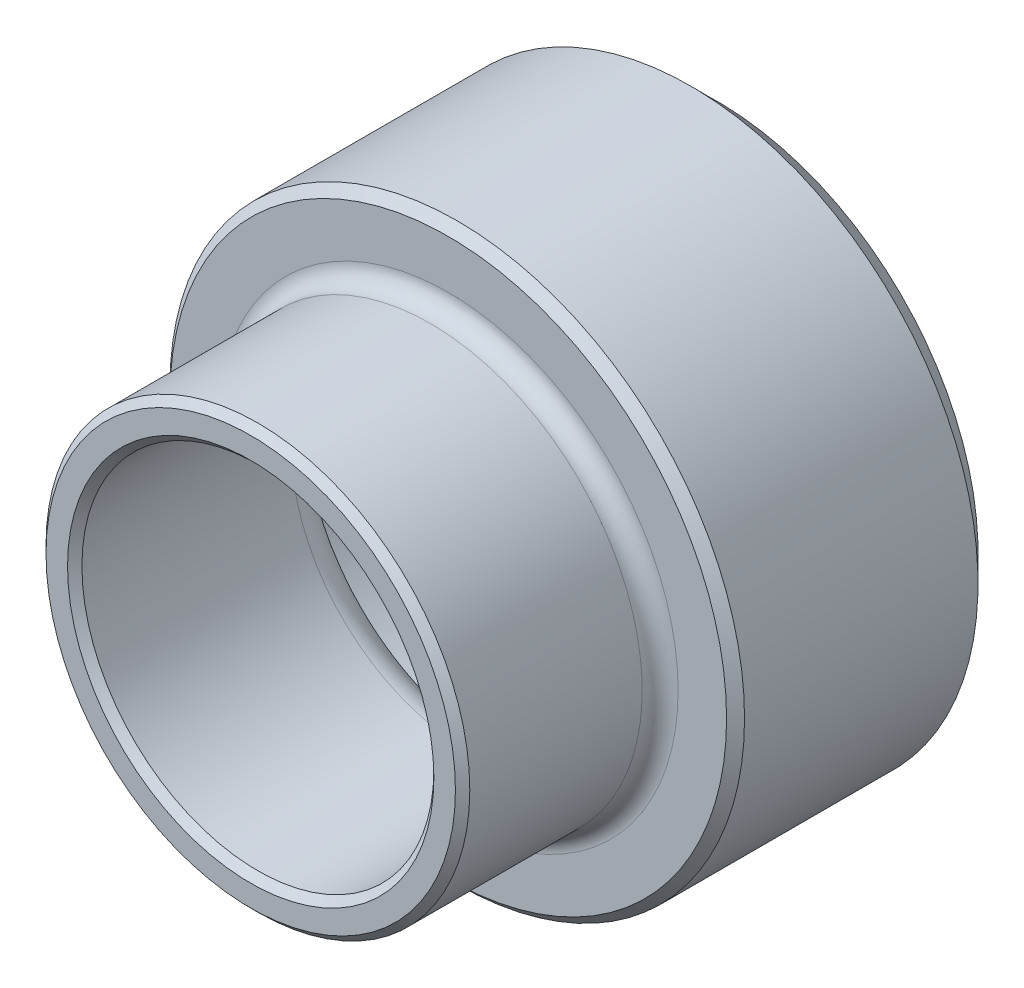
ISO-10303-21;
HEADER;
FILE_DESCRIPTION(('STEP AP214'),'2;1');
FILE_NAME('part.step','',(''),(''),'','','');
FILE_SCHEMA(('AUTOMOTIVE_DESIGN { 1 0 10303 214 1 1 1 1 }'));
ENDSEC;
DATA;
#1=APPLICATION_CONTEXT('core data for automotive mechanical design processes');
#2=APPLICATION_PROTOCOL_DEFINITION('international standard','automotive_design',2000,#1);
#3=PRODUCT_CONTEXT('',#1,'mechanical');
#4=PRODUCT('Part','Part','',(#3));
#5=PRODUCT_RELATED_PRODUCT_CATEGORY('part','',(#4));
#6=PRODUCT_DEFINITION_FORMATION('','',#4);
#7=PRODUCT_DEFINITION_CONTEXT('part definition',#1,'design');
#8=PRODUCT_DEFINITION('design','',#6,#7);
#9=PRODUCT_DEFINITION_SHAPE('','',#8);
#10=(LENGTH_UNIT() NAMED_UNIT(*) SI_UNIT(.MILLI.,.METRE.));
#11=(NAMED_UNIT(*) PLANE_ANGLE_UNIT() SI_UNIT($,.RADIAN.));
#12=(NAMED_UNIT(*) SI_UNIT($,.STERADIAN.) SOLID_ANGLE_UNIT());
#13=UNCERTAINTY_MEASURE_WITH_UNIT(LENGTH_MEASURE(1.E-05),#10,'distance_accuracy_value','');
#14=(GEOMETRIC_REPRESENTATION_CONTEXT(3) GLOBAL_UNCERTAINTY_ASSIGNED_CONTEXT((#13)) GLOBAL_UNIT_ASSIGNED_CONTEXT((#10,
#11,#12)) REPRESENTATION_CONTEXT('',''));
#15=CARTESIAN_POINT('',(0.,0.,0.));
#16=DIRECTION('',(0.,0.,1.));
#17=DIRECTION('',(1.,0.,0.));
#18=AXIS2_PLACEMENT_3D('',#15,#16,#17);
#19=CARTESIAN_POINT('',(0.,0.,13.));
#20=DIRECTION('',(0.,0.,-1.));
#21=DIRECTION('',(-1.,0.,0.));
#22=AXIS2_PLACEMENT_3D('',#19,#20,#21);
#23=CYLINDRICAL_SURFACE('',#22,5.9);
#24=CARTESIAN_POINT('',(0.,0.,12.8));
#25=DIRECTION('',(0.,0.,1.));
#26=DIRECTION('',(1.,0.,0.));
#27=AXIS2_PLACEMENT_3D('',#24,#25,#26);
#28=CIRCLE('',#27,5.9);
#29=CARTESIAN_POINT('',(5.9,0.,12.8));
#30=VERTEX_POINT('',#29);
#31=EDGE_CURVE('E70',#30,#30,#28,.F.);
#32=ORIENTED_EDGE('',*,*,#31,.T.);
#33=EDGE_LOOP('',(#32));
#34=FACE_BOUND('',#33,.T.);
#35=CARTESIAN_POINT('',(0.,0.,7.99999999998723));
#36=DIRECTION('',(0.,0.,-1.));
#37=DIRECTION('',(-1.,0.,0.));
#38=AXIS2_PLACEMENT_3D('',#35,#36,#37);
#39=CIRCLE('',#38,5.9);
#40=CARTESIAN_POINT('',(-5.9,0.,7.99999999998723));
#41=VERTEX_POINT('',#40);
#42=EDGE_CURVE('E91',#41,#41,#39,.T.);
#43=ORIENTED_EDGE('',*,*,#42,.F.);
#44=EDGE_LOOP('',(#43));
#45=FACE_BOUND('',#44,.T.);
#46=ADVANCED_FACE('F47',(#34,#45),#23,.T.);
#47=CARTESIAN_POINT('',(0.,0.,7.99999999998723));
#48=DIRECTION('',(0.,0.,-1.));
#49=DIRECTION('',(-1.,0.,0.));
#50=AXIS2_PLACEMENT_3D('',#47,#48,#49);
#51=TOROIDAL_SURFACE('',#50,6.4,0.5);
#52=ORIENTED_EDGE('',*,*,#42,.T.);
#53=EDGE_LOOP('',(#52));
#54=FACE_BOUND('',#53,.T.);
#55=CARTESIAN_POINT('',(0.,0.,7.49999999998723));
#56=DIRECTION('',(0.,0.,-1.));
#57=DIRECTION('',(-1.,0.,0.));
#58=AXIS2_PLACEMENT_3D('',#55,#56,#57);
#59=CIRCLE('',#58,6.4);
#60=CARTESIAN_POINT('',(-6.4,0.,7.49999999998723));
#61=VERTEX_POINT('',#60);
#62=EDGE_CURVE('E94',#61,#61,#59,.T.);
#63=ORIENTED_EDGE('',*,*,#62,.F.);
#64=EDGE_LOOP('',(#63));
#65=FACE_BOUND('',#64,.T.);
#66=ADVANCED_FACE('F118',(#54,#65),#51,.F.);
#67=CARTESIAN_POINT('',(8.00000000001278,0.,7.49999999998723));
#68=DIRECTION('',(0.,0.,1.));
#69=DIRECTION('',(1.,0.,0.));
#70=AXIS2_PLACEMENT_3D('',#67,#68,#69);
#71=PLANE('',#70);
#72=CARTESIAN_POINT('',(0.,0.,7.49999999998723));
#73=DIRECTION('',(0.,0.,1.));
#74=DIRECTION('',(1.,0.,0.));
#75=AXIS2_PLACEMENT_3D('',#72,#73,#74);
#76=CIRCLE('',#75,7.75000000001278);
#77=CARTESIAN_POINT('',(7.75000000001278,0.,7.49999999998723));
#78=VERTEX_POINT('',#77);
#79=EDGE_CURVE('E79',#78,#78,#76,.T.);
#80=ORIENTED_EDGE('',*,*,#79,.T.);
#81=EDGE_LOOP('',(#80));
#82=FACE_BOUND('',#81,.T.);
#83=ORIENTED_EDGE('',*,*,#62,.T.);
#84=EDGE_LOOP('',(#83));
#85=FACE_BOUND('',#84,.T.);
#86=ADVANCED_FACE('F124',(#82,#85),#71,.T.);
#87=CARTESIAN_POINT('',(0.,0.,13.));
#88=DIRECTION('',(0.,0.,-1.));
#89=DIRECTION('',(-1.,0.,0.));
#90=AXIS2_PLACEMENT_3D('',#87,#88,#89);
#91=CYLINDRICAL_SURFACE('',#90,8.00000000001278);
#92=CARTESIAN_POINT('',(0.,0.,7.24999999998722));
#93=DIRECTION('',(0.,0.,1.));
#94=DIRECTION('',(1.,0.,0.));
#95=AXIS2_PLACEMENT_3D('',#92,#93,#94);
#96=CIRCLE('',#95,8.00000000001278);
#97=CARTESIAN_POINT('',(8.00000000001278,0.,7.24999999998722));
#98=VERTEX_POINT('',#97);
#99=EDGE_CURVE('E82',#98,#98,#96,.F.);
#100=ORIENTED_EDGE('',*,*,#99,.T.);
#101=EDGE_LOOP('',(#100));
#102=FACE_BOUND('',#101,.T.);
#103=CARTESIAN_POINT('',(0.,0.,0.750000000000004));
#104=DIRECTION('',(0.,0.,-1.));
#105=DIRECTION('',(-1.,0.,0.));
#106=AXIS2_PLACEMENT_3D('',#103,#104,#105);
#107=CIRCLE('',#106,8.00000000001278);
#108=CARTESIAN_POINT('',(-8.00000000001278,0.,0.750000000000004));
#109=VERTEX_POINT('',#108);
#110=EDGE_CURVE('E85',#109,#109,#107,.F.);
#111=ORIENTED_EDGE('',*,*,#110,.T.);
#112=EDGE_LOOP('',(#111));
#113=FACE_BOUND('',#112,.T.);
#114=ADVANCED_FACE('F163',(#102,#113),#91,.T.);
#115=CARTESIAN_POINT('',(0.,0.,0.));
#116=DIRECTION('',(0.,0.,-1.));
#117=DIRECTION('',(-1.,0.,0.));
#118=AXIS2_PLACEMENT_3D('',#115,#116,#117);
#119=PLANE('',#118);
#120=CARTESIAN_POINT('',(0.,0.,0.));
#121=DIRECTION('',(0.,0.,-1.));
#122=DIRECTION('',(-1.,0.,0.));
#123=AXIS2_PLACEMENT_3D('',#120,#121,#122);
#124=CIRCLE('',#123,6.2);
#125=CARTESIAN_POINT('',(-6.2,0.,0.));
#126=VERTEX_POINT('',#125);
#127=EDGE_CURVE('E73',#126,#126,#124,.F.);
#128=ORIENTED_EDGE('',*,*,#127,.T.);
#129=EDGE_LOOP('',(#128));
#130=FACE_BOUND('',#129,.T.);
#131=CARTESIAN_POINT('',(0.,0.,0.));
#132=DIRECTION('',(0.,0.,-1.));
#133=DIRECTION('',(-1.,0.,0.));
#134=AXIS2_PLACEMENT_3D('',#131,#132,#133);
#135=CIRCLE('',#134,7.25000000001278);
#136=CARTESIAN_POINT('',(-7.25000000001278,0.,0.));
#137=VERTEX_POINT('',#136);
#138=EDGE_CURVE('E88',#137,#137,#135,.T.);
#139=ORIENTED_EDGE('',*,*,#138,.T.);
#140=EDGE_LOOP('',(#139));
#141=FACE_BOUND('',#140,.T.);
#142=ADVANCED_FACE('F158',(#130,#141),#119,.T.);
#143=CARTESIAN_POINT('',(0.,0.,13.));
#144=DIRECTION('',(0.,0.,-1.));
#145=DIRECTION('',(-1.,0.,0.));
#146=AXIS2_PLACEMENT_3D('',#143,#144,#145);
#147=CYLINDRICAL_SURFACE('',#146,4.9);
#148=CARTESIAN_POINT('',(0.,0.,6.97671945911809));
#149=DIRECTION('',(0.,0.,-1.));
#150=DIRECTION('',(-1.,0.,0.));
#151=AXIS2_PLACEMENT_3D('',#148,#149,#150);
#152=CIRCLE('',#151,4.9);
#153=CARTESIAN_POINT('',(-4.9,0.,6.97671945911809));
#154=VERTEX_POINT('',#153);
#155=EDGE_CURVE('E12',#154,#154,#152,.T.);
#156=ORIENTED_EDGE('',*,*,#155,.T.);
#157=EDGE_LOOP('',(#156));
#158=FACE_BOUND('',#157,.T.);
#159=CARTESIAN_POINT('',(0.,0.,12.8));
#160=DIRECTION('',(0.,0.,1.));
#161=DIRECTION('',(1.,0.,0.));
#162=AXIS2_PLACEMENT_3D('',#159,#160,#161);
#163=CIRCLE('',#162,4.9);
#164=CARTESIAN_POINT('',(4.9,0.,12.8));
#165=VERTEX_POINT('',#164);
#166=EDGE_CURVE('E58',#165,#165,#163,.T.);
#167=ORIENTED_EDGE('',*,*,#166,.T.);
#168=EDGE_LOOP('',(#167));
#169=FACE_BOUND('',#168,.T.);
#170=ADVANCED_FACE('F152',(#158,#169),#147,.F.);
#171=CARTESIAN_POINT('',(5.9,0.,13.));
#172=DIRECTION('',(0.,0.,1.));
#173=DIRECTION('',(1.,0.,0.));
#174=AXIS2_PLACEMENT_3D('',#171,#172,#173);
#175=PLANE('',#174);
#176=CARTESIAN_POINT('',(0.,0.,13.));
#177=DIRECTION('',(0.,0.,1.));
#178=DIRECTION('',(1.,0.,0.));
#179=AXIS2_PLACEMENT_3D('',#176,#177,#178);
#180=CIRCLE('',#179,5.70000000000001);
#181=CARTESIAN_POINT('',(5.70000000000001,0.,13.));
#182=VERTEX_POINT('',#181);
#183=EDGE_CURVE('E62',#182,#182,#180,.T.);
#184=ORIENTED_EDGE('',*,*,#183,.T.);
#185=EDGE_LOOP('',(#184));
#186=FACE_BOUND('',#185,.T.);
#187=CARTESIAN_POINT('',(0.,0.,13.));
#188=DIRECTION('',(0.,0.,1.));
#189=DIRECTION('',(1.,0.,0.));
#190=AXIS2_PLACEMENT_3D('',#187,#188,#189);
#191=CIRCLE('',#190,5.1);
#192=CARTESIAN_POINT('',(5.1,0.,13.));
#193=VERTEX_POINT('',#192);
#194=EDGE_CURVE('E67',#193,#193,#191,.F.);
#195=ORIENTED_EDGE('',*,*,#194,.T.);
#196=EDGE_LOOP('',(#195));
#197=FACE_BOUND('',#196,.T.);
#198=ADVANCED_FACE('F115',(#186,#197),#175,.T.);
#199=CARTESIAN_POINT('',(0.,0.,5.75));
#200=DIRECTION('',(0.,0.,-1.));
#201=DIRECTION('',(-1.,0.,0.));
#202=AXIS2_PLACEMENT_3D('',#199,#200,#201);
#203=CONICAL_SURFACE('',#202,6.,1.02974425867665);
#204=CARTESIAN_POINT('',(0.,0.,6.11955215841597));
#205=DIRECTION('',(0.,0.,-1.));
#206=DIRECTION('',(-1.,0.,0.));
#207=AXIS2_PLACEMENT_3D('',#204,#205,#206);
#208=CIRCLE('',#207,5.38496192508995);
#209=CARTESIAN_POINT('',(-5.38496192508995,0.,6.11955215841597));
#210=VERTEX_POINT('',#209);
#211=EDGE_CURVE('E54',#210,#210,#208,.F.);
#212=ORIENTED_EDGE('',*,*,#211,.T.);
#213=EDGE_LOOP('',(#212));
#214=FACE_BOUND('',#213,.T.);
#215=CARTESIAN_POINT('',(0.,0.,5.75));
#216=DIRECTION('',(0.,0.,-1.));
#217=DIRECTION('',(-1.,0.,0.));
#218=AXIS2_PLACEMENT_3D('',#215,#216,#217);
#219=CIRCLE('',#218,6.);
#220=CARTESIAN_POINT('',(-6.,0.,5.75));
#221=VERTEX_POINT('',#220);
#222=EDGE_CURVE('E97',#221,#221,#219,.T.);
#223=ORIENTED_EDGE('',*,*,#222,.T.);
#224=EDGE_LOOP('',(#223));
#225=FACE_BOUND('',#224,.T.);
#226=ADVANCED_FACE('F101',(#214,#225),#203,.F.);
#227=CARTESIAN_POINT('',(0.,0.,0.));
#228=DIRECTION('',(0.,0.,-1.));
#229=DIRECTION('',(-1.,0.,0.));
#230=AXIS2_PLACEMENT_3D('',#227,#228,#229);
#231=CYLINDRICAL_SURFACE('',#230,6.);
#232=CARTESIAN_POINT('',(0.,0.,0.2));
#233=DIRECTION('',(0.,0.,-1.));
#234=DIRECTION('',(-1.,0.,0.));
#235=AXIS2_PLACEMENT_3D('',#232,#233,#234);
#236=CIRCLE('',#235,6.);
#237=CARTESIAN_POINT('',(-6.,0.,0.2));
#238=VERTEX_POINT('',#237);
#239=EDGE_CURVE('E76',#238,#238,#236,.T.);
#240=ORIENTED_EDGE('',*,*,#239,.T.);
#241=EDGE_LOOP('',(#240));
#242=FACE_BOUND('',#241,.T.);
#243=ORIENTED_EDGE('',*,*,#222,.F.);
#244=EDGE_LOOP('',(#243));
#245=FACE_BOUND('',#244,.T.);
#246=ADVANCED_FACE('F103',(#242,#245),#231,.F.);
#247=CARTESIAN_POINT('',(0.,0.,0.));
#248=DIRECTION('',(0.,0.,1.));
#249=DIRECTION('',(1.,0.,0.));
#250=AXIS2_PLACEMENT_3D('',#247,#248,#249);
#251=CONICAL_SURFACE('',#250,7.25000000001278,0.785398163397446);
#252=ORIENTED_EDGE('',*,*,#110,.F.);
#253=EDGE_LOOP('',(#252));
#254=FACE_BOUND('',#253,.T.);
#255=ORIENTED_EDGE('',*,*,#138,.F.);
#256=EDGE_LOOP('',(#255));
#257=FACE_BOUND('',#256,.T.);
#258=ADVANCED_FACE('F105',(#254,#257),#251,.T.);
#259=CARTESIAN_POINT('',(0.,0.,7.24999999998722));
#260=DIRECTION('',(0.,0.,-1.));
#261=DIRECTION('',(-1.,0.,0.));
#262=AXIS2_PLACEMENT_3D('',#259,#260,#261);
#263=CONICAL_SURFACE('',#262,8.00000000001278,0.785398163397445);
#264=ORIENTED_EDGE('',*,*,#79,.F.);
#265=EDGE_LOOP('',(#264));
#266=FACE_BOUND('',#265,.T.);
#267=ORIENTED_EDGE('',*,*,#99,.F.);
#268=EDGE_LOOP('',(#267));
#269=FACE_BOUND('',#268,.T.);
#270=ADVANCED_FACE('F112',(#266,#269),#263,.T.);
#271=CARTESIAN_POINT('',(0.,0.,0.2));
#272=DIRECTION('',(0.,0.,-1.));
#273=DIRECTION('',(-1.,0.,0.));
#274=AXIS2_PLACEMENT_3D('',#271,#272,#273);
#275=CONICAL_SURFACE('',#274,6.,0.78539816339745);
#276=CARTESIAN_POINT('',(-6.2,0.,0.));
#277=CARTESIAN_POINT('',(-6.19791666666667,0.,0.00208333333333332));
#278=CARTESIAN_POINT('',(-6.19583333333333,0.,0.0041666666666666));
#279=CARTESIAN_POINT('',(-6.19166666666667,0.,0.00833333333333316));
#280=CARTESIAN_POINT('',(-6.18958333333333,0.,0.0104166666666664));
#281=CARTESIAN_POINT('',(-6.18541666666667,0.,0.0145833333333332));
#282=CARTESIAN_POINT('',(-6.18333333333333,0.,0.0166666666666666));
#283=CARTESIAN_POINT('',(-6.17916666666667,0.,0.0208333333333333));
#284=CARTESIAN_POINT('',(-6.17708333333333,0.,0.0229166666666665));
#285=CARTESIAN_POINT('',(-6.17291666666667,0.,0.0270833333333332));
#286=CARTESIAN_POINT('',(-6.17083333333333,0.,0.0291666666666665));
#287=CARTESIAN_POINT('',(-6.16666666666667,0.,0.0333333333333332));
#288=CARTESIAN_POINT('',(-6.16458333333333,0.,0.0354166666666666));
#289=CARTESIAN_POINT('',(-6.16041666666667,0.,0.0395833333333332));
#290=CARTESIAN_POINT('',(-6.15833333333333,0.,0.0416666666666664));
#291=CARTESIAN_POINT('',(-6.15416666666667,0.,0.0458333333333331));
#292=CARTESIAN_POINT('',(-6.15208333333333,0.,0.0479166666666666));
#293=CARTESIAN_POINT('',(-6.14791666666667,0.,0.0520833333333333));
#294=CARTESIAN_POINT('',(-6.14583333333333,0.,0.0541666666666665));
#295=CARTESIAN_POINT('',(-6.14166666666667,0.,0.0583333333333331));
#296=CARTESIAN_POINT('',(-6.13958333333333,0.,0.0604166666666665));
#297=CARTESIAN_POINT('',(-6.13541666666667,0.,0.0645833333333332));
#298=CARTESIAN_POINT('',(-6.13333333333333,0.,0.0666666666666665));
#299=CARTESIAN_POINT('',(-6.12916666666667,0.,0.0708333333333331));
#300=CARTESIAN_POINT('',(-6.12708333333333,0.,0.0729166666666664));
#301=CARTESIAN_POINT('',(-6.12291666666667,0.,0.0770833333333331));
#302=CARTESIAN_POINT('',(-6.12083333333333,0.,0.0791666666666665));
#303=CARTESIAN_POINT('',(-6.11666666666667,0.,0.0833333333333332));
#304=CARTESIAN_POINT('',(-6.11458333333333,0.,0.0854166666666665));
#305=CARTESIAN_POINT('',(-6.11041666666667,0.,0.0895833333333331));
#306=CARTESIAN_POINT('',(-6.10833333333333,0.,0.0916666666666664));
#307=CARTESIAN_POINT('',(-6.10416666666667,0.,0.0958333333333331));
#308=CARTESIAN_POINT('',(-6.10208333333333,0.,0.0979166666666664));
#309=CARTESIAN_POINT('',(-6.09791666666667,0.,0.102083333333333));
#310=CARTESIAN_POINT('',(-6.09583333333333,0.,0.104166666666666));
#311=CARTESIAN_POINT('',(-6.09166666666667,0.,0.108333333333333));
#312=CARTESIAN_POINT('',(-6.08958333333333,0.,0.110416666666666));
#313=CARTESIAN_POINT('',(-6.08541666666667,0.,0.114583333333333));
#314=CARTESIAN_POINT('',(-6.08333333333333,0.,0.116666666666666));
#315=CARTESIAN_POINT('',(-6.07916666666667,0.,0.120833333333333));
#316=CARTESIAN_POINT('',(-6.07708333333333,0.,0.122916666666666));
#317=CARTESIAN_POINT('',(-6.07291666666667,0.,0.127083333333333));
#318=CARTESIAN_POINT('',(-6.07083333333333,0.,0.129166666666666));
#319=CARTESIAN_POINT('',(-6.06666666666667,0.,0.133333333333333));
#320=CARTESIAN_POINT('',(-6.06458333333333,0.,0.135416666666666));
#321=CARTESIAN_POINT('',(-6.06041666666667,0.,0.139583333333333));
#322=CARTESIAN_POINT('',(-6.05833333333333,0.,0.141666666666666));
#323=CARTESIAN_POINT('',(-6.05416666666667,0.,0.145833333333333));
#324=CARTESIAN_POINT('',(-6.05208333333333,0.,0.147916666666666));
#325=CARTESIAN_POINT('',(-6.04791666666667,0.,0.152083333333333));
#326=CARTESIAN_POINT('',(-6.04583333333333,0.,0.154166666666666));
#327=CARTESIAN_POINT('',(-6.04166666666667,0.,0.158333333333333));
#328=CARTESIAN_POINT('',(-6.03958333333333,0.,0.160416666666666));
#329=CARTESIAN_POINT('',(-6.03541666666667,0.,0.164583333333333));
#330=CARTESIAN_POINT('',(-6.03333333333333,0.,0.166666666666666));
#331=CARTESIAN_POINT('',(-6.02916666666667,0.,0.170833333333333));
#332=CARTESIAN_POINT('',(-6.02708333333333,0.,0.172916666666666));
#333=CARTESIAN_POINT('',(-6.02291666666667,0.,0.177083333333333));
#334=CARTESIAN_POINT('',(-6.02083333333333,0.,0.179166666666666));
#335=CARTESIAN_POINT('',(-6.01666666666667,0.,0.183333333333333));
#336=CARTESIAN_POINT('',(-6.01458333333333,0.,0.185416666666666));
#337=CARTESIAN_POINT('',(-6.01041666666667,0.,0.189583333333333));
#338=CARTESIAN_POINT('',(-6.00833333333333,0.,0.191666666666666));
#339=CARTESIAN_POINT('',(-6.00416666666667,0.,0.195833333333333));
#340=CARTESIAN_POINT('',(-6.00208333333333,0.,0.197916666666666));
#341=CARTESIAN_POINT('',(-6.,0.,0.2));
#342=B_SPLINE_CURVE_WITH_KNOTS('',3,(#276,#277,#278,#279,#280,#281,#282,#283,#284,#285,#286,
#287,#288,#289,#290,#291,#292,#293,#294,#295,#296,#297,#298,#299,#300,#301,#302,#303,#304,#305,
#306,#307,#308,#309,#310,#311,#312,#313,#314,#315,#316,#317,#318,#319,#320,#321,#322,#323,#324,
#325,#326,#327,#328,#329,#330,#331,#332,#333,#334,#335,#336,#337,#338,#339,#340,#341),
.UNSPECIFIED.,.F.,.F.,(4,2,2,2,2,2,2,2,2,2,2,2,2,2,2,2,2,2,2,2,2,2,2,2,2,2,2,2,2,2,2,2,4),(0.,
0.00883883476483196,0.0176776695296639,0.0265165042944953,0.0353553390593272,0.0441941738241592,
0.0530330085889912,0.0618718433538232,0.0707106781186545,0.0795495128834865,0.0883883476483184,
0.0972271824131504,0.106066017177982,0.114904851942814,0.123743686707646,0.132582521472478,
0.14142135623731,0.150260191002142,0.159099025766974,0.167937860531805,0.176776695296637,
0.185615530061469,0.194454364826301,0.203293199591133,0.212132034355964,0.220970869120796,
0.229809703885628,0.23864853865046,0.247487373415292,0.256326208180124,0.265165042944955,
0.274003877709787,0.282842712474619),.UNSPECIFIED.);
#343=EDGE_CURVE('BSEAM132',#126,#238,#342,.T.);
#344=ORIENTED_EDGE('',*,*,#127,.F.);
#345=ORIENTED_EDGE('',*,*,#239,.F.);
#346=ORIENTED_EDGE('',*,*,#343,.T.);
#347=ORIENTED_EDGE('',*,*,#343,.F.);
#348=EDGE_LOOP('',(#344,#346,#345,#347));
#349=FACE_BOUND('',#348,.T.);
#350=ADVANCED_FACE('F132',(#349),#275,.F.);
#351=CARTESIAN_POINT('',(0.,0.,12.8));
#352=DIRECTION('',(0.,0.,-1.));
#353=DIRECTION('',(-1.,0.,0.));
#354=AXIS2_PLACEMENT_3D('',#351,#352,#353);
#355=CONICAL_SURFACE('',#354,5.9,0.785398163397442);
#356=ORIENTED_EDGE('',*,*,#183,.F.);
#357=EDGE_LOOP('',(#356));
#358=FACE_BOUND('',#357,.T.);
#359=ORIENTED_EDGE('',*,*,#31,.F.);
#360=EDGE_LOOP('',(#359));
#361=FACE_BOUND('',#360,.T.);
#362=ADVANCED_FACE('F136',(#358,#361),#355,.T.);
#363=CARTESIAN_POINT('',(0.,0.,13.));
#364=DIRECTION('',(0.,0.,1.));
#365=DIRECTION('',(1.,0.,0.));
#366=AXIS2_PLACEMENT_3D('',#363,#364,#365);
#367=CONICAL_SURFACE('',#366,5.1,0.785398163397444);
#368=ORIENTED_EDGE('',*,*,#166,.F.);
#369=EDGE_LOOP('',(#368));
#370=FACE_BOUND('',#369,.T.);
#371=ORIENTED_EDGE('',*,*,#194,.F.);
#372=EDGE_LOOP('',(#371));
#373=FACE_BOUND('',#372,.T.);
#374=ADVANCED_FACE('F139',(#370,#373),#367,.F.);
#375=CARTESIAN_POINT('',(0.,0.,6.97671945911809));
#376=DIRECTION('',(0.,0.,-1.));
#377=DIRECTION('',(-1.,0.,0.));
#378=AXIS2_PLACEMENT_3D('',#375,#376,#377);
#379=TOROIDAL_SURFACE('',#378,5.9,1.);
#380=ORIENTED_EDGE('',*,*,#155,.F.);
#381=EDGE_LOOP('',(#380));
#382=FACE_BOUND('',#381,.T.);
#383=ORIENTED_EDGE('',*,*,#211,.F.);
#384=EDGE_LOOP('',(#383));
#385=FACE_BOUND('',#384,.T.);
#386=ADVANCED_FACE('F49',(#382,#385),#379,.T.);
#387=CLOSED_SHELL('',(#46,#66,#86,#114,#142,#170,#198,#226,#246,#258,#270,#350,#362,#374,#386));
#388=MANIFOLD_SOLID_BREP('B2',#387);
#389=ADVANCED_BREP_SHAPE_REPRESENTATION('',(#18,#388),#14);
#390=SHAPE_DEFINITION_REPRESENTATION(#9,#389);
ENDSEC;
END-ISO-10303-21;
